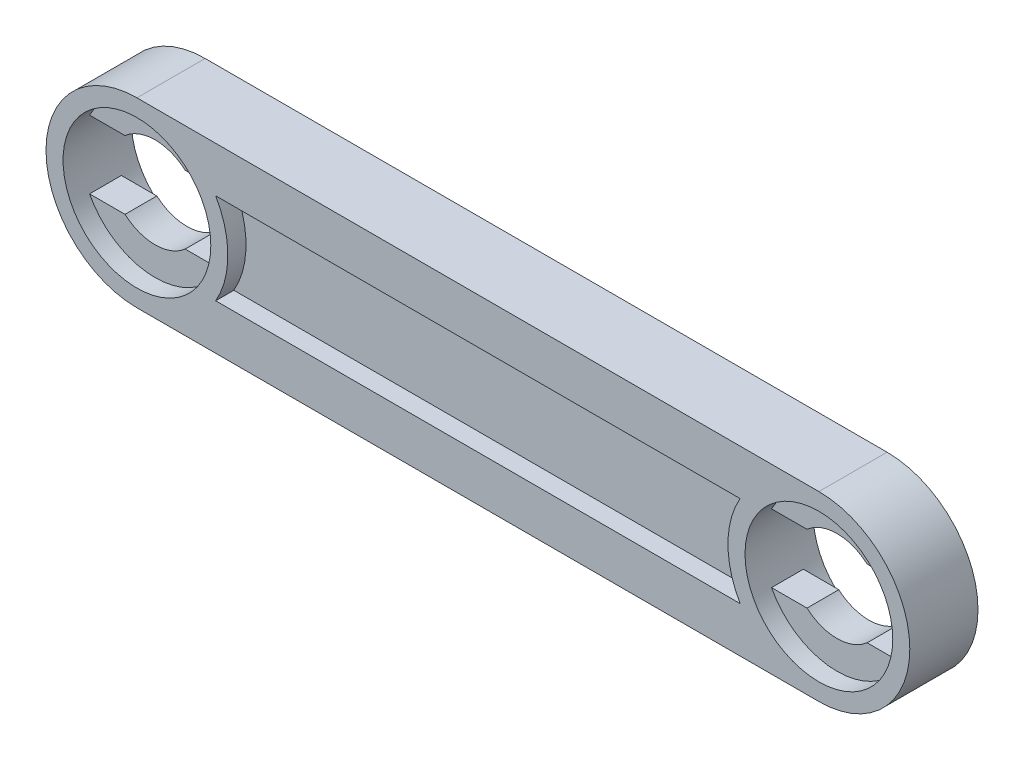
ISO-10303-21;
HEADER;
FILE_DESCRIPTION(('STEP AP214'),'2;1');
FILE_NAME('part.step','',(''),(''),'','','');
FILE_SCHEMA(('AUTOMOTIVE_DESIGN { 1 0 10303 214 1 1 1 1 }'));
ENDSEC;
DATA;
#1=APPLICATION_CONTEXT('core data for automotive mechanical design processes');
#2=APPLICATION_PROTOCOL_DEFINITION('international standard','automotive_design',2000,#1);
#3=PRODUCT_CONTEXT('',#1,'mechanical');
#4=PRODUCT('Part','Part','',(#3));
#5=PRODUCT_RELATED_PRODUCT_CATEGORY('part','',(#4));
#6=PRODUCT_DEFINITION_FORMATION('','',#4);
#7=PRODUCT_DEFINITION_CONTEXT('part definition',#1,'design');
#8=PRODUCT_DEFINITION('design','',#6,#7);
#9=PRODUCT_DEFINITION_SHAPE('','',#8);
#10=(LENGTH_UNIT() NAMED_UNIT(*) SI_UNIT(.MILLI.,.METRE.));
#11=(NAMED_UNIT(*) PLANE_ANGLE_UNIT() SI_UNIT($,.RADIAN.));
#12=(NAMED_UNIT(*) SI_UNIT($,.STERADIAN.) SOLID_ANGLE_UNIT());
#13=UNCERTAINTY_MEASURE_WITH_UNIT(LENGTH_MEASURE(1.E-05),#10,'distance_accuracy_value','');
#14=(GEOMETRIC_REPRESENTATION_CONTEXT(3) GLOBAL_UNCERTAINTY_ASSIGNED_CONTEXT((#13)) GLOBAL_UNIT_ASSIGNED_CONTEXT((#10,
#11,#12)) REPRESENTATION_CONTEXT('',''));
#15=CARTESIAN_POINT('',(0.,0.,0.));
#16=DIRECTION('',(0.,0.,1.));
#17=DIRECTION('',(1.,0.,0.));
#18=AXIS2_PLACEMENT_3D('',#15,#16,#17);
#19=CARTESIAN_POINT('',(0.,0.,0.));
#20=DIRECTION('',(0.,0.,1.));
#21=DIRECTION('',(1.,0.,0.));
#22=AXIS2_PLACEMENT_3D('',#19,#20,#21);
#23=PLANE('',#22);
#24=CARTESIAN_POINT('',(30.,0.,0.));
#25=DIRECTION('',(0.,0.,-1.));
#26=DIRECTION('',(1.,0.,0.));
#27=AXIS2_PLACEMENT_3D('',#24,#25,#26);
#28=CIRCLE('',#27,4.);
#29=CARTESIAN_POINT('',(26.5358983848623,-2.,0.));
#30=VERTEX_POINT('',#29);
#31=CARTESIAN_POINT('',(26.5358983848622,2.,0.));
#32=VERTEX_POINT('',#31);
#33=EDGE_CURVE('E57',#30,#32,#28,.T.);
#34=ORIENTED_EDGE('',*,*,#33,.F.);
#35=DIRECTION('',(1.,0.,0.));
#36=VECTOR('',#35,1.);
#37=CARTESIAN_POINT('',(3.46410161513775,-2.,0.));
#38=LINE('',#37,#36);
#39=CARTESIAN_POINT('',(3.46410161513775,-2.,0.));
#40=VERTEX_POINT('',#39);
#41=EDGE_CURVE('E261',#40,#30,#38,.T.);
#42=ORIENTED_EDGE('',*,*,#41,.F.);
#43=CARTESIAN_POINT('',(0.,0.,0.));
#44=DIRECTION('',(0.,0.,-1.));
#45=DIRECTION('',(1.,0.,0.));
#46=AXIS2_PLACEMENT_3D('',#43,#44,#45);
#47=CIRCLE('',#46,4.);
#48=CARTESIAN_POINT('',(3.46410161513776,2.,0.));
#49=VERTEX_POINT('',#48);
#50=EDGE_CURVE('E275',#49,#40,#47,.T.);
#51=ORIENTED_EDGE('',*,*,#50,.F.);
#52=DIRECTION('',(-1.,0.,0.));
#53=VECTOR('',#52,1.);
#54=CARTESIAN_POINT('',(3.46410161513775,2.,0.));
#55=LINE('',#54,#53);
#56=EDGE_CURVE('E272',#32,#49,#55,.T.);
#57=ORIENTED_EDGE('',*,*,#56,.F.);
#58=EDGE_LOOP('',(#34,#42,#51,#57));
#59=FACE_BOUND('',#58,.T.);
#60=CARTESIAN_POINT('',(0.,0.,0.));
#61=DIRECTION('',(0.,0.,1.));
#62=DIRECTION('',(1.,0.,0.));
#63=AXIS2_PLACEMENT_3D('',#60,#61,#62);
#64=CIRCLE('',#63,4.);
#65=CARTESIAN_POINT('',(0.,4.,0.));
#66=VERTEX_POINT('',#65);
#67=CARTESIAN_POINT('',(0.,-4.,0.));
#68=VERTEX_POINT('',#67);
#69=EDGE_CURVE('E393',#66,#68,#64,.T.);
#70=ORIENTED_EDGE('',*,*,#69,.T.);
#71=DIRECTION('',(1.,0.,0.));
#72=VECTOR('',#71,1.);
#73=CARTESIAN_POINT('',(0.,-4.,0.));
#74=LINE('',#73,#72);
#75=CARTESIAN_POINT('',(30.,-4.,0.));
#76=VERTEX_POINT('',#75);
#77=EDGE_CURVE('E423',#68,#76,#74,.T.);
#78=ORIENTED_EDGE('',*,*,#77,.T.);
#79=CARTESIAN_POINT('',(30.,0.,0.));
#80=DIRECTION('',(0.,0.,1.));
#81=DIRECTION('',(1.,0.,0.));
#82=AXIS2_PLACEMENT_3D('',#79,#80,#81);
#83=CIRCLE('',#82,4.);
#84=CARTESIAN_POINT('',(30.,4.,0.));
#85=VERTEX_POINT('',#84);
#86=EDGE_CURVE('E426',#76,#85,#83,.T.);
#87=ORIENTED_EDGE('',*,*,#86,.T.);
#88=DIRECTION('',(-1.,0.,0.));
#89=VECTOR('',#88,1.);
#90=CARTESIAN_POINT('',(0.,4.,0.));
#91=LINE('',#90,#89);
#92=EDGE_CURVE('E411',#85,#66,#91,.T.);
#93=ORIENTED_EDGE('',*,*,#92,.T.);
#94=EDGE_LOOP('',(#70,#78,#87,#93));
#95=FACE_BOUND('',#94,.T.);
#96=CARTESIAN_POINT('',(0.,0.,0.));
#97=DIRECTION('',(0.,0.,1.));
#98=DIRECTION('',(1.,0.,0.));
#99=AXIS2_PLACEMENT_3D('',#96,#97,#98);
#100=CIRCLE('',#99,3.25);
#101=CARTESIAN_POINT('',(3.25,0.,0.));
#102=VERTEX_POINT('',#101);
#103=EDGE_CURVE('E387',#102,#102,#100,.T.);
#104=ORIENTED_EDGE('',*,*,#103,.F.);
#105=EDGE_LOOP('',(#104));
#106=FACE_BOUND('',#105,.T.);
#107=CARTESIAN_POINT('',(30.,0.,0.));
#108=DIRECTION('',(0.,0.,-1.));
#109=DIRECTION('',(-1.,0.,0.));
#110=AXIS2_PLACEMENT_3D('',#107,#108,#109);
#111=CIRCLE('',#110,3.25);
#112=CARTESIAN_POINT('',(26.75,0.,0.));
#113=VERTEX_POINT('',#112);
#114=EDGE_CURVE('E324',#113,#113,#111,.T.);
#115=ORIENTED_EDGE('',*,*,#114,.T.);
#116=EDGE_LOOP('',(#115));
#117=FACE_BOUND('',#116,.T.);
#118=ADVANCED_FACE('F34',(#59,#95,#106,#117),#23,.T.);
#119=CARTESIAN_POINT('',(32.8831406486677,-1.5,-3.001));
#120=DIRECTION('',(0.,1.,0.));
#121=DIRECTION('',(0.,0.,1.));
#122=AXIS2_PLACEMENT_3D('',#119,#120,#121);
#123=PLANE('',#122);
#124=DIRECTION('',(1.,0.,0.));
#125=VECTOR('',#124,1.);
#126=CARTESIAN_POINT('',(32.8831406486677,-1.5,-2.2));
#127=LINE('',#126,#125);
#128=CARTESIAN_POINT('',(31.3228756555323,-1.5,-2.2));
#129=VERTEX_POINT('',#128);
#130=CARTESIAN_POINT('',(32.8831406486677,-1.5,-2.2));
#131=VERTEX_POINT('',#130);
#132=EDGE_CURVE('E300',#129,#131,#127,.T.);
#133=ORIENTED_EDGE('',*,*,#132,.F.);
#134=DIRECTION('',(0.,0.,1.));
#135=VECTOR('',#134,1.);
#136=CARTESIAN_POINT('',(31.3228756555323,-1.5,-3.001));
#137=LINE('',#136,#135);
#138=CARTESIAN_POINT('',(31.3228756555323,-1.5,-0.8));
#139=VERTEX_POINT('',#138);
#140=EDGE_CURVE('E331',#129,#139,#137,.T.);
#141=ORIENTED_EDGE('',*,*,#140,.T.);
#142=DIRECTION('',(1.,0.,0.));
#143=VECTOR('',#142,1.);
#144=CARTESIAN_POINT('',(32.8831406486677,-1.5,-0.8));
#145=LINE('',#144,#143);
#146=CARTESIAN_POINT('',(32.8831406486677,-1.5,-0.8));
#147=VERTEX_POINT('',#146);
#148=EDGE_CURVE('E318',#139,#147,#145,.T.);
#149=ORIENTED_EDGE('',*,*,#148,.T.);
#150=DIRECTION('',(0.,0.,1.));
#151=VECTOR('',#150,1.);
#152=CARTESIAN_POINT('',(32.8831406486677,-1.5,-3.001));
#153=LINE('',#152,#151);
#154=EDGE_CURVE('E328',#131,#147,#153,.T.);
#155=ORIENTED_EDGE('',*,*,#154,.F.);
#156=EDGE_LOOP('',(#133,#141,#149,#155));
#157=FACE_BOUND('',#156,.T.);
#158=ADVANCED_FACE('F476',(#157),#123,.T.);
#159=CARTESIAN_POINT('',(30.,0.,-3.001));
#160=DIRECTION('',(0.,0.,1.));
#161=DIRECTION('',(1.,0.,0.));
#162=AXIS2_PLACEMENT_3D('',#159,#160,#161);
#163=CYLINDRICAL_SURFACE('',#162,2.);
#164=CARTESIAN_POINT('',(30.,0.,-2.2));
#165=DIRECTION('',(0.,0.,1.));
#166=DIRECTION('',(1.,0.,0.));
#167=AXIS2_PLACEMENT_3D('',#164,#165,#166);
#168=CIRCLE('',#167,2.);
#169=CARTESIAN_POINT('',(28.6771243444677,-1.5,-2.2));
#170=VERTEX_POINT('',#169);
#171=EDGE_CURVE('E298',#170,#129,#168,.T.);
#172=ORIENTED_EDGE('',*,*,#171,.F.);
#173=DIRECTION('',(0.,0.,1.));
#174=VECTOR('',#173,1.);
#175=CARTESIAN_POINT('',(28.6771243444677,-1.5,-3.001));
#176=LINE('',#175,#174);
#177=CARTESIAN_POINT('',(28.6771243444677,-1.5,-0.800000000000001));
#178=VERTEX_POINT('',#177);
#179=EDGE_CURVE('E333',#170,#178,#176,.T.);
#180=ORIENTED_EDGE('',*,*,#179,.T.);
#181=CARTESIAN_POINT('',(30.,0.,-0.8));
#182=DIRECTION('',(0.,0.,1.));
#183=DIRECTION('',(1.,0.,0.));
#184=AXIS2_PLACEMENT_3D('',#181,#182,#183);
#185=CIRCLE('',#184,2.);
#186=EDGE_CURVE('E315',#178,#139,#185,.T.);
#187=ORIENTED_EDGE('',*,*,#186,.T.);
#188=ORIENTED_EDGE('',*,*,#140,.F.);
#189=EDGE_LOOP('',(#172,#180,#187,#188));
#190=FACE_BOUND('',#189,.T.);
#191=ADVANCED_FACE('F482',(#190),#163,.F.);
#192=CARTESIAN_POINT('',(28.6771243444677,-1.5,-3.001));
#193=DIRECTION('',(0.,1.,0.));
#194=DIRECTION('',(0.,0.,1.));
#195=AXIS2_PLACEMENT_3D('',#192,#193,#194);
#196=PLANE('',#195);
#197=DIRECTION('',(1.,0.,0.));
#198=VECTOR('',#197,1.);
#199=CARTESIAN_POINT('',(28.6771243444677,-1.5,-2.2));
#200=LINE('',#199,#198);
#201=CARTESIAN_POINT('',(27.1168593513323,-1.5,-2.2));
#202=VERTEX_POINT('',#201);
#203=EDGE_CURVE('E296',#202,#170,#200,.T.);
#204=ORIENTED_EDGE('',*,*,#203,.F.);
#205=DIRECTION('',(0.,0.,1.));
#206=VECTOR('',#205,1.);
#207=CARTESIAN_POINT('',(27.1168593513323,-1.5,-3.001));
#208=LINE('',#207,#206);
#209=CARTESIAN_POINT('',(27.1168593513323,-1.5,-0.8));
#210=VERTEX_POINT('',#209);
#211=EDGE_CURVE('E335',#202,#210,#208,.T.);
#212=ORIENTED_EDGE('',*,*,#211,.T.);
#213=DIRECTION('',(1.,0.,0.));
#214=VECTOR('',#213,1.);
#215=CARTESIAN_POINT('',(28.6771243444677,-1.5,-0.8));
#216=LINE('',#215,#214);
#217=EDGE_CURVE('E312',#210,#178,#216,.T.);
#218=ORIENTED_EDGE('',*,*,#217,.T.);
#219=ORIENTED_EDGE('',*,*,#179,.F.);
#220=EDGE_LOOP('',(#204,#212,#218,#219));
#221=FACE_BOUND('',#220,.T.);
#222=ADVANCED_FACE('F586',(#221),#196,.T.);
#223=CARTESIAN_POINT('',(28.6771243444677,1.5,-3.001));
#224=DIRECTION('',(0.,-1.,0.));
#225=DIRECTION('',(0.,0.,-1.));
#226=AXIS2_PLACEMENT_3D('',#223,#224,#225);
#227=PLANE('',#226);
#228=DIRECTION('',(-1.,0.,0.));
#229=VECTOR('',#228,1.);
#230=CARTESIAN_POINT('',(28.6771243444677,1.5,-2.2));
#231=LINE('',#230,#229);
#232=CARTESIAN_POINT('',(28.6771243444677,1.5,-2.2));
#233=VERTEX_POINT('',#232);
#234=CARTESIAN_POINT('',(27.1168593513323,1.5,-2.2));
#235=VERTEX_POINT('',#234);
#236=EDGE_CURVE('E294',#233,#235,#231,.T.);
#237=ORIENTED_EDGE('',*,*,#236,.F.);
#238=DIRECTION('',(0.,0.,1.));
#239=VECTOR('',#238,1.);
#240=CARTESIAN_POINT('',(28.6771243444677,1.5,-3.001));
#241=LINE('',#240,#239);
#242=CARTESIAN_POINT('',(28.6771243444677,1.5,-0.8));
#243=VERTEX_POINT('',#242);
#244=EDGE_CURVE('E339',#233,#243,#241,.T.);
#245=ORIENTED_EDGE('',*,*,#244,.T.);
#246=DIRECTION('',(-1.,0.,0.));
#247=VECTOR('',#246,1.);
#248=CARTESIAN_POINT('',(28.6771243444677,1.5,-0.8));
#249=LINE('',#248,#247);
#250=CARTESIAN_POINT('',(27.1168593513323,1.5,-0.8));
#251=VERTEX_POINT('',#250);
#252=EDGE_CURVE('E309',#243,#251,#249,.T.);
#253=ORIENTED_EDGE('',*,*,#252,.T.);
#254=DIRECTION('',(0.,0.,1.));
#255=VECTOR('',#254,1.);
#256=CARTESIAN_POINT('',(27.1168593513323,1.5,-3.001));
#257=LINE('',#256,#255);
#258=EDGE_CURVE('E337',#235,#251,#257,.T.);
#259=ORIENTED_EDGE('',*,*,#258,.F.);
#260=EDGE_LOOP('',(#237,#245,#253,#259));
#261=FACE_BOUND('',#260,.T.);
#262=ADVANCED_FACE('F590',(#261),#227,.T.);
#263=CARTESIAN_POINT('',(30.,0.,-3.001));
#264=DIRECTION('',(0.,0.,1.));
#265=DIRECTION('',(1.,0.,0.));
#266=AXIS2_PLACEMENT_3D('',#263,#264,#265);
#267=CYLINDRICAL_SURFACE('',#266,2.);
#268=CARTESIAN_POINT('',(30.,0.,-2.2));
#269=DIRECTION('',(0.,0.,1.));
#270=DIRECTION('',(1.,0.,0.));
#271=AXIS2_PLACEMENT_3D('',#268,#269,#270);
#272=CIRCLE('',#271,2.);
#273=CARTESIAN_POINT('',(31.3228756555323,1.5,-2.2));
#274=VERTEX_POINT('',#273);
#275=EDGE_CURVE('E292',#274,#233,#272,.T.);
#276=ORIENTED_EDGE('',*,*,#275,.F.);
#277=DIRECTION('',(0.,0.,1.));
#278=VECTOR('',#277,1.);
#279=CARTESIAN_POINT('',(31.3228756555323,1.5,-3.001));
#280=LINE('',#279,#278);
#281=CARTESIAN_POINT('',(31.3228756555323,1.5,-0.800000000000001));
#282=VERTEX_POINT('',#281);
#283=EDGE_CURVE('E341',#274,#282,#280,.T.);
#284=ORIENTED_EDGE('',*,*,#283,.T.);
#285=CARTESIAN_POINT('',(30.,0.,-0.8));
#286=DIRECTION('',(0.,0.,1.));
#287=DIRECTION('',(1.,0.,0.));
#288=AXIS2_PLACEMENT_3D('',#285,#286,#287);
#289=CIRCLE('',#288,2.);
#290=EDGE_CURVE('E306',#282,#243,#289,.T.);
#291=ORIENTED_EDGE('',*,*,#290,.T.);
#292=ORIENTED_EDGE('',*,*,#244,.F.);
#293=EDGE_LOOP('',(#276,#284,#291,#292));
#294=FACE_BOUND('',#293,.T.);
#295=ADVANCED_FACE('F532',(#294),#267,.F.);
#296=CARTESIAN_POINT('',(32.8831406486677,1.5,-3.001));
#297=DIRECTION('',(0.,-1.,0.));
#298=DIRECTION('',(0.,0.,-1.));
#299=AXIS2_PLACEMENT_3D('',#296,#297,#298);
#300=PLANE('',#299);
#301=DIRECTION('',(-1.,0.,0.));
#302=VECTOR('',#301,1.);
#303=CARTESIAN_POINT('',(32.8831406486677,1.5,-2.2));
#304=LINE('',#303,#302);
#305=CARTESIAN_POINT('',(32.8831406486677,1.5,-2.2));
#306=VERTEX_POINT('',#305);
#307=EDGE_CURVE('E290',#306,#274,#304,.T.);
#308=ORIENTED_EDGE('',*,*,#307,.F.);
#309=DIRECTION('',(0.,0.,1.));
#310=VECTOR('',#309,1.);
#311=CARTESIAN_POINT('',(32.8831406486677,1.5,-3.001));
#312=LINE('',#311,#310);
#313=CARTESIAN_POINT('',(32.8831406486677,1.5,-0.8));
#314=VERTEX_POINT('',#313);
#315=EDGE_CURVE('E327',#306,#314,#312,.T.);
#316=ORIENTED_EDGE('',*,*,#315,.T.);
#317=DIRECTION('',(-1.,0.,0.));
#318=VECTOR('',#317,1.);
#319=CARTESIAN_POINT('',(32.8831406486677,1.5,-0.8));
#320=LINE('',#319,#318);
#321=EDGE_CURVE('E11',#314,#282,#320,.T.);
#322=ORIENTED_EDGE('',*,*,#321,.T.);
#323=ORIENTED_EDGE('',*,*,#283,.F.);
#324=EDGE_LOOP('',(#308,#316,#322,#323));
#325=FACE_BOUND('',#324,.T.);
#326=ADVANCED_FACE('F518',(#325),#300,.T.);
#327=CARTESIAN_POINT('',(0.,0.,-3.));
#328=DIRECTION('',(0.,0.,1.));
#329=DIRECTION('',(1.,0.,0.));
#330=AXIS2_PLACEMENT_3D('',#327,#328,#329);
#331=PLANE('',#330);
#332=DIRECTION('',(-1.,0.,0.));
#333=VECTOR('',#332,1.);
#334=CARTESIAN_POINT('',(26.,-2.,-3.));
#335=LINE('',#334,#333);
#336=CARTESIAN_POINT('',(26.,-2.,-3.));
#337=VERTEX_POINT('',#336);
#338=CARTESIAN_POINT('',(4.,-2.,-3.));
#339=VERTEX_POINT('',#338);
#340=EDGE_CURVE('E248',#337,#339,#335,.T.);
#341=ORIENTED_EDGE('',*,*,#340,.F.);
#342=DIRECTION('',(0.,-1.,0.));
#343=VECTOR('',#342,1.);
#344=CARTESIAN_POINT('',(26.,-2.,-3.));
#345=LINE('',#344,#343);
#346=CARTESIAN_POINT('',(26.,2.,-3.));
#347=VERTEX_POINT('',#346);
#348=EDGE_CURVE('E49',#347,#337,#345,.T.);
#349=ORIENTED_EDGE('',*,*,#348,.F.);
#350=DIRECTION('',(1.,0.,0.));
#351=VECTOR('',#350,1.);
#352=CARTESIAN_POINT('',(26.,2.,-3.));
#353=LINE('',#352,#351);
#354=CARTESIAN_POINT('',(4.,2.,-3.));
#355=VERTEX_POINT('',#354);
#356=EDGE_CURVE('E239',#355,#347,#353,.T.);
#357=ORIENTED_EDGE('',*,*,#356,.F.);
#358=DIRECTION('',(0.,1.,0.));
#359=VECTOR('',#358,1.);
#360=CARTESIAN_POINT('',(4.,-2.,-3.));
#361=LINE('',#360,#359);
#362=EDGE_CURVE('E242',#339,#355,#361,.T.);
#363=ORIENTED_EDGE('',*,*,#362,.F.);
#364=EDGE_LOOP('',(#341,#349,#357,#363));
#365=FACE_BOUND('',#364,.T.);
#366=CARTESIAN_POINT('',(0.,0.,-3.));
#367=DIRECTION('',(0.,0.,1.));
#368=DIRECTION('',(1.,0.,0.));
#369=AXIS2_PLACEMENT_3D('',#366,#367,#368);
#370=CIRCLE('',#369,3.25);
#371=CARTESIAN_POINT('',(3.25,0.,-3.));
#372=VERTEX_POINT('',#371);
#373=EDGE_CURVE('E384',#372,#372,#370,.F.);
#374=ORIENTED_EDGE('',*,*,#373,.F.);
#375=EDGE_LOOP('',(#374));
#376=FACE_BOUND('',#375,.T.);
#377=CARTESIAN_POINT('',(0.,0.,-3.));
#378=DIRECTION('',(0.,0.,1.));
#379=DIRECTION('',(1.,0.,0.));
#380=AXIS2_PLACEMENT_3D('',#377,#378,#379);
#381=CIRCLE('',#380,4.);
#382=CARTESIAN_POINT('',(0.,4.,-3.));
#383=VERTEX_POINT('',#382);
#384=CARTESIAN_POINT('',(0.,-4.,-3.));
#385=VERTEX_POINT('',#384);
#386=EDGE_CURVE('E407',#383,#385,#381,.T.);
#387=ORIENTED_EDGE('',*,*,#386,.F.);
#388=DIRECTION('',(-1.,0.,0.));
#389=VECTOR('',#388,1.);
#390=CARTESIAN_POINT('',(0.,4.,-3.));
#391=LINE('',#390,#389);
#392=CARTESIAN_POINT('',(30.,4.,-3.));
#393=VERTEX_POINT('',#392);
#394=EDGE_CURVE('E417',#393,#383,#391,.T.);
#395=ORIENTED_EDGE('',*,*,#394,.F.);
#396=CARTESIAN_POINT('',(30.,0.,-3.));
#397=DIRECTION('',(0.,0.,1.));
#398=DIRECTION('',(1.,0.,0.));
#399=AXIS2_PLACEMENT_3D('',#396,#397,#398);
#400=CIRCLE('',#399,4.);
#401=CARTESIAN_POINT('',(30.,-4.,-3.));
#402=VERTEX_POINT('',#401);
#403=EDGE_CURVE('E414',#402,#393,#400,.T.);
#404=ORIENTED_EDGE('',*,*,#403,.F.);
#405=DIRECTION('',(1.,0.,0.));
#406=VECTOR('',#405,1.);
#407=CARTESIAN_POINT('',(0.,-4.,-3.));
#408=LINE('',#407,#406);
#409=EDGE_CURVE('E410',#385,#402,#408,.T.);
#410=ORIENTED_EDGE('',*,*,#409,.F.);
#411=EDGE_LOOP('',(#387,#395,#404,#410));
#412=FACE_BOUND('',#411,.T.);
#413=CARTESIAN_POINT('',(30.,0.,-3.));
#414=DIRECTION('',(0.,0.,1.));
#415=DIRECTION('',(1.,0.,0.));
#416=AXIS2_PLACEMENT_3D('',#413,#414,#415);
#417=CIRCLE('',#416,3.25);
#418=CARTESIAN_POINT('',(33.25,0.,-3.));
#419=VERTEX_POINT('',#418);
#420=EDGE_CURVE('E321',#419,#419,#417,.T.);
#421=ORIENTED_EDGE('',*,*,#420,.T.);
#422=EDGE_LOOP('',(#421));
#423=FACE_BOUND('',#422,.T.);
#424=ADVANCED_FACE('F488',(#365,#376,#412,#423),#331,.F.);
#425=CARTESIAN_POINT('',(-2.8831406486677,1.5,-3.001));
#426=DIRECTION('',(0.,1.,0.));
#427=DIRECTION('',(0.,0.,1.));
#428=AXIS2_PLACEMENT_3D('',#425,#426,#427);
#429=PLANE('',#428);
#430=DIRECTION('',(0.,0.,1.));
#431=VECTOR('',#430,1.);
#432=CARTESIAN_POINT('',(-2.8831406486677,1.5,-3.001));
#433=LINE('',#432,#431);
#434=CARTESIAN_POINT('',(-2.8831406486677,1.5,-2.2));
#435=VERTEX_POINT('',#434);
#436=CARTESIAN_POINT('',(-2.8831406486677,1.5,-0.8));
#437=VERTEX_POINT('',#436);
#438=EDGE_CURVE('E391',#435,#437,#433,.T.);
#439=ORIENTED_EDGE('',*,*,#438,.F.);
#440=DIRECTION('',(1.,0.,0.));
#441=VECTOR('',#440,1.);
#442=CARTESIAN_POINT('',(-2.8831406486677,1.5,-2.2));
#443=LINE('',#442,#441);
#444=CARTESIAN_POINT('',(-1.3228756555323,1.5,-2.2));
#445=VERTEX_POINT('',#444);
#446=EDGE_CURVE('E362',#435,#445,#443,.T.);
#447=ORIENTED_EDGE('',*,*,#446,.T.);
#448=DIRECTION('',(0.,0.,1.));
#449=VECTOR('',#448,1.);
#450=CARTESIAN_POINT('',(-1.3228756555323,1.5,-3.001));
#451=LINE('',#450,#449);
#452=CARTESIAN_POINT('',(-1.3228756555323,1.5,-0.8));
#453=VERTEX_POINT('',#452);
#454=EDGE_CURVE('E394',#445,#453,#451,.T.);
#455=ORIENTED_EDGE('',*,*,#454,.T.);
#456=DIRECTION('',(1.,0.,0.));
#457=VECTOR('',#456,1.);
#458=CARTESIAN_POINT('',(-2.8831406486677,1.5,-0.8));
#459=LINE('',#458,#457);
#460=EDGE_CURVE('E381',#437,#453,#459,.T.);
#461=ORIENTED_EDGE('',*,*,#460,.F.);
#462=EDGE_LOOP('',(#439,#447,#455,#461));
#463=FACE_BOUND('',#462,.T.);
#464=ADVANCED_FACE('F517',(#463),#429,.F.);
#465=CARTESIAN_POINT('',(0.,0.,-3.001));
#466=DIRECTION('',(0.,0.,1.));
#467=DIRECTION('',(1.,0.,0.));
#468=AXIS2_PLACEMENT_3D('',#465,#466,#467);
#469=CYLINDRICAL_SURFACE('',#468,2.);
#470=ORIENTED_EDGE('',*,*,#454,.F.);
#471=CARTESIAN_POINT('',(0.,0.,-2.2));
#472=DIRECTION('',(0.,0.,1.));
#473=DIRECTION('',(1.,0.,0.));
#474=AXIS2_PLACEMENT_3D('',#471,#472,#473);
#475=CIRCLE('',#474,2.);
#476=CARTESIAN_POINT('',(1.3228756555323,1.5,-2.2));
#477=VERTEX_POINT('',#476);
#478=EDGE_CURVE('E359',#445,#477,#475,.F.);
#479=ORIENTED_EDGE('',*,*,#478,.T.);
#480=DIRECTION('',(0.,0.,1.));
#481=VECTOR('',#480,1.);
#482=CARTESIAN_POINT('',(1.3228756555323,1.5,-3.001));
#483=LINE('',#482,#481);
#484=CARTESIAN_POINT('',(1.3228756555323,1.5,-0.800000000000001));
#485=VERTEX_POINT('',#484);
#486=EDGE_CURVE('E396',#477,#485,#483,.T.);
#487=ORIENTED_EDGE('',*,*,#486,.T.);
#488=CARTESIAN_POINT('',(0.,0.,-0.8));
#489=DIRECTION('',(0.,0.,1.));
#490=DIRECTION('',(1.,0.,0.));
#491=AXIS2_PLACEMENT_3D('',#488,#489,#490);
#492=CIRCLE('',#491,2.);
#493=EDGE_CURVE('E378',#453,#485,#492,.F.);
#494=ORIENTED_EDGE('',*,*,#493,.F.);
#495=EDGE_LOOP('',(#470,#479,#487,#494));
#496=FACE_BOUND('',#495,.T.);
#497=ADVANCED_FACE('F529',(#496),#469,.F.);
#498=CARTESIAN_POINT('',(1.3228756555323,1.5,-3.001));
#499=DIRECTION('',(0.,1.,0.));
#500=DIRECTION('',(0.,0.,1.));
#501=AXIS2_PLACEMENT_3D('',#498,#499,#500);
#502=PLANE('',#501);
#503=ORIENTED_EDGE('',*,*,#486,.F.);
#504=DIRECTION('',(1.,0.,0.));
#505=VECTOR('',#504,1.);
#506=CARTESIAN_POINT('',(1.3228756555323,1.5,-2.2));
#507=LINE('',#506,#505);
#508=CARTESIAN_POINT('',(2.8831406486677,1.5,-2.2));
#509=VERTEX_POINT('',#508);
#510=EDGE_CURVE('E356',#477,#509,#507,.T.);
#511=ORIENTED_EDGE('',*,*,#510,.T.);
#512=DIRECTION('',(0.,0.,1.));
#513=VECTOR('',#512,1.);
#514=CARTESIAN_POINT('',(2.8831406486677,1.5,-3.001));
#515=LINE('',#514,#513);
#516=CARTESIAN_POINT('',(2.8831406486677,1.5,-0.8));
#517=VERTEX_POINT('',#516);
#518=EDGE_CURVE('E398',#509,#517,#515,.T.);
#519=ORIENTED_EDGE('',*,*,#518,.T.);
#520=DIRECTION('',(1.,0.,0.));
#521=VECTOR('',#520,1.);
#522=CARTESIAN_POINT('',(1.3228756555323,1.5,-0.8));
#523=LINE('',#522,#521);
#524=EDGE_CURVE('E375',#485,#517,#523,.T.);
#525=ORIENTED_EDGE('',*,*,#524,.F.);
#526=EDGE_LOOP('',(#503,#511,#519,#525));
#527=FACE_BOUND('',#526,.T.);
#528=ADVANCED_FACE('F807',(#527),#502,.F.);
#529=CARTESIAN_POINT('',(1.3228756555323,-1.5,-3.001));
#530=DIRECTION('',(0.,-1.,0.));
#531=DIRECTION('',(0.,0.,-1.));
#532=AXIS2_PLACEMENT_3D('',#529,#530,#531);
#533=PLANE('',#532);
#534=DIRECTION('',(0.,0.,1.));
#535=VECTOR('',#534,1.);
#536=CARTESIAN_POINT('',(2.8831406486677,-1.5,-3.001));
#537=LINE('',#536,#535);
#538=CARTESIAN_POINT('',(2.8831406486677,-1.5,-2.2));
#539=VERTEX_POINT('',#538);
#540=CARTESIAN_POINT('',(2.8831406486677,-1.5,-0.8));
#541=VERTEX_POINT('',#540);
#542=EDGE_CURVE('E400',#539,#541,#537,.T.);
#543=ORIENTED_EDGE('',*,*,#542,.F.);
#544=DIRECTION('',(-1.,0.,0.));
#545=VECTOR('',#544,1.);
#546=CARTESIAN_POINT('',(1.3228756555323,-1.5,-2.2));
#547=LINE('',#546,#545);
#548=CARTESIAN_POINT('',(1.32287565553229,-1.5,-2.2));
#549=VERTEX_POINT('',#548);
#550=EDGE_CURVE('E353',#539,#549,#547,.T.);
#551=ORIENTED_EDGE('',*,*,#550,.T.);
#552=DIRECTION('',(0.,0.,1.));
#553=VECTOR('',#552,1.);
#554=CARTESIAN_POINT('',(1.32287565553229,-1.5,-3.001));
#555=LINE('',#554,#553);
#556=CARTESIAN_POINT('',(1.32287565553229,-1.5,-0.8));
#557=VERTEX_POINT('',#556);
#558=EDGE_CURVE('E402',#549,#557,#555,.T.);
#559=ORIENTED_EDGE('',*,*,#558,.T.);
#560=DIRECTION('',(-1.,0.,0.));
#561=VECTOR('',#560,1.);
#562=CARTESIAN_POINT('',(1.3228756555323,-1.5,-0.8));
#563=LINE('',#562,#561);
#564=EDGE_CURVE('E372',#541,#557,#563,.T.);
#565=ORIENTED_EDGE('',*,*,#564,.F.);
#566=EDGE_LOOP('',(#543,#551,#559,#565));
#567=FACE_BOUND('',#566,.T.);
#568=ADVANCED_FACE('F454',(#567),#533,.F.);
#569=CARTESIAN_POINT('',(0.,0.,-3.001));
#570=DIRECTION('',(0.,0.,1.));
#571=DIRECTION('',(1.,0.,0.));
#572=AXIS2_PLACEMENT_3D('',#569,#570,#571);
#573=CYLINDRICAL_SURFACE('',#572,2.);
#574=ORIENTED_EDGE('',*,*,#558,.F.);
#575=CARTESIAN_POINT('',(0.,0.,-2.2));
#576=DIRECTION('',(0.,0.,1.));
#577=DIRECTION('',(1.,0.,0.));
#578=AXIS2_PLACEMENT_3D('',#575,#576,#577);
#579=CIRCLE('',#578,2.);
#580=CARTESIAN_POINT('',(-1.3228756555323,-1.5,-2.2));
#581=VERTEX_POINT('',#580);
#582=EDGE_CURVE('E350',#549,#581,#579,.F.);
#583=ORIENTED_EDGE('',*,*,#582,.T.);
#584=DIRECTION('',(0.,0.,1.));
#585=VECTOR('',#584,1.);
#586=CARTESIAN_POINT('',(-1.3228756555323,-1.5,-3.001));
#587=LINE('',#586,#585);
#588=CARTESIAN_POINT('',(-1.3228756555323,-1.5,-0.800000000000001));
#589=VERTEX_POINT('',#588);
#590=EDGE_CURVE('E404',#581,#589,#587,.T.);
#591=ORIENTED_EDGE('',*,*,#590,.T.);
#592=CARTESIAN_POINT('',(0.,0.,-0.8));
#593=DIRECTION('',(0.,0.,1.));
#594=DIRECTION('',(1.,0.,0.));
#595=AXIS2_PLACEMENT_3D('',#592,#593,#594);
#596=CIRCLE('',#595,2.);
#597=EDGE_CURVE('E369',#557,#589,#596,.F.);
#598=ORIENTED_EDGE('',*,*,#597,.F.);
#599=EDGE_LOOP('',(#574,#583,#591,#598));
#600=FACE_BOUND('',#599,.T.);
#601=ADVANCED_FACE('F457',(#600),#573,.F.);
#602=CARTESIAN_POINT('',(-2.8831406486677,-1.5,-3.001));
#603=DIRECTION('',(0.,-1.,0.));
#604=DIRECTION('',(0.,0.,-1.));
#605=AXIS2_PLACEMENT_3D('',#602,#603,#604);
#606=PLANE('',#605);
#607=ORIENTED_EDGE('',*,*,#590,.F.);
#608=DIRECTION('',(-1.,0.,0.));
#609=VECTOR('',#608,1.);
#610=CARTESIAN_POINT('',(-2.8831406486677,-1.5,-2.2));
#611=LINE('',#610,#609);
#612=CARTESIAN_POINT('',(-2.8831406486677,-1.5,-2.2));
#613=VERTEX_POINT('',#612);
#614=EDGE_CURVE('E347',#581,#613,#611,.T.);
#615=ORIENTED_EDGE('',*,*,#614,.T.);
#616=DIRECTION('',(0.,0.,1.));
#617=VECTOR('',#616,1.);
#618=CARTESIAN_POINT('',(-2.8831406486677,-1.5,-3.001));
#619=LINE('',#618,#617);
#620=CARTESIAN_POINT('',(-2.8831406486677,-1.5,-0.8));
#621=VERTEX_POINT('',#620);
#622=EDGE_CURVE('E390',#613,#621,#619,.T.);
#623=ORIENTED_EDGE('',*,*,#622,.T.);
#624=DIRECTION('',(-1.,0.,0.));
#625=VECTOR('',#624,1.);
#626=CARTESIAN_POINT('',(-2.8831406486677,-1.5,-0.8));
#627=LINE('',#626,#625);
#628=EDGE_CURVE('E42',#589,#621,#627,.T.);
#629=ORIENTED_EDGE('',*,*,#628,.F.);
#630=EDGE_LOOP('',(#607,#615,#623,#629));
#631=FACE_BOUND('',#630,.T.);
#632=ADVANCED_FACE('F458',(#631),#606,.F.);
#633=CARTESIAN_POINT('',(0.,0.,-3.));
#634=DIRECTION('',(0.,0.,1.));
#635=DIRECTION('',(1.,0.,0.));
#636=AXIS2_PLACEMENT_3D('',#633,#634,#635);
#637=CYLINDRICAL_SURFACE('',#636,4.);
#638=ORIENTED_EDGE('',*,*,#69,.F.);
#639=DIRECTION('',(0.,0.,1.));
#640=VECTOR('',#639,1.);
#641=CARTESIAN_POINT('',(0.,4.,-3.));
#642=LINE('',#641,#640);
#643=EDGE_CURVE('E431',#383,#66,#642,.T.);
#644=ORIENTED_EDGE('',*,*,#643,.F.);
#645=ORIENTED_EDGE('',*,*,#386,.T.);
#646=DIRECTION('',(0.,0.,1.));
#647=VECTOR('',#646,1.);
#648=CARTESIAN_POINT('',(0.,-4.,-3.));
#649=LINE('',#648,#647);
#650=EDGE_CURVE('E420',#385,#68,#649,.T.);
#651=ORIENTED_EDGE('',*,*,#650,.T.);
#652=EDGE_LOOP('',(#638,#644,#645,#651));
#653=FACE_BOUND('',#652,.T.);
#654=ADVANCED_FACE('F36',(#653),#637,.T.);
#655=CARTESIAN_POINT('',(0.,4.,-3.));
#656=DIRECTION('',(0.,1.,0.));
#657=DIRECTION('',(0.,0.,1.));
#658=AXIS2_PLACEMENT_3D('',#655,#656,#657);
#659=PLANE('',#658);
#660=ORIENTED_EDGE('',*,*,#92,.F.);
#661=DIRECTION('',(0.,0.,1.));
#662=VECTOR('',#661,1.);
#663=CARTESIAN_POINT('',(30.,4.,-3.));
#664=LINE('',#663,#662);
#665=EDGE_CURVE('E433',#393,#85,#664,.T.);
#666=ORIENTED_EDGE('',*,*,#665,.F.);
#667=ORIENTED_EDGE('',*,*,#394,.T.);
#668=ORIENTED_EDGE('',*,*,#643,.T.);
#669=EDGE_LOOP('',(#660,#666,#667,#668));
#670=FACE_BOUND('',#669,.T.);
#671=ADVANCED_FACE('F490',(#670),#659,.T.);
#672=CARTESIAN_POINT('',(30.,0.,-3.));
#673=DIRECTION('',(0.,0.,1.));
#674=DIRECTION('',(1.,0.,0.));
#675=AXIS2_PLACEMENT_3D('',#672,#673,#674);
#676=CYLINDRICAL_SURFACE('',#675,4.);
#677=ORIENTED_EDGE('',*,*,#86,.F.);
#678=DIRECTION('',(0.,0.,1.));
#679=VECTOR('',#678,1.);
#680=CARTESIAN_POINT('',(30.,-4.,-3.));
#681=LINE('',#680,#679);
#682=EDGE_CURVE('E435',#402,#76,#681,.T.);
#683=ORIENTED_EDGE('',*,*,#682,.F.);
#684=ORIENTED_EDGE('',*,*,#403,.T.);
#685=ORIENTED_EDGE('',*,*,#665,.T.);
#686=EDGE_LOOP('',(#677,#683,#684,#685));
#687=FACE_BOUND('',#686,.T.);
#688=ADVANCED_FACE('F493',(#687),#676,.T.);
#689=CARTESIAN_POINT('',(0.,-4.,-3.));
#690=DIRECTION('',(0.,-1.,0.));
#691=DIRECTION('',(0.,0.,-1.));
#692=AXIS2_PLACEMENT_3D('',#689,#690,#691);
#693=PLANE('',#692);
#694=ORIENTED_EDGE('',*,*,#77,.F.);
#695=ORIENTED_EDGE('',*,*,#650,.F.);
#696=ORIENTED_EDGE('',*,*,#409,.T.);
#697=ORIENTED_EDGE('',*,*,#682,.T.);
#698=EDGE_LOOP('',(#694,#695,#696,#697));
#699=FACE_BOUND('',#698,.T.);
#700=ADVANCED_FACE('F496',(#699),#693,.T.);
#701=CARTESIAN_POINT('',(0.,0.,-3.001));
#702=DIRECTION('',(0.,0.,1.));
#703=DIRECTION('',(1.,0.,0.));
#704=AXIS2_PLACEMENT_3D('',#701,#702,#703);
#705=CYLINDRICAL_SURFACE('',#704,3.25);
#706=CARTESIAN_POINT('',(0.,0.,-2.2));
#707=DIRECTION('',(0.,0.,1.));
#708=DIRECTION('',(1.,0.,0.));
#709=AXIS2_PLACEMENT_3D('',#706,#707,#708);
#710=CIRCLE('',#709,3.25);
#711=EDGE_CURVE('E344',#509,#435,#710,.T.);
#712=ORIENTED_EDGE('',*,*,#711,.T.);
#713=ORIENTED_EDGE('',*,*,#438,.T.);
#714=CARTESIAN_POINT('',(0.,0.,-0.8));
#715=DIRECTION('',(0.,0.,1.));
#716=DIRECTION('',(1.,0.,0.));
#717=AXIS2_PLACEMENT_3D('',#714,#715,#716);
#718=CIRCLE('',#717,3.25);
#719=EDGE_CURVE('E366',#517,#437,#718,.T.);
#720=ORIENTED_EDGE('',*,*,#719,.F.);
#721=ORIENTED_EDGE('',*,*,#518,.F.);
#722=EDGE_LOOP('',(#712,#713,#720,#721));
#723=FACE_BOUND('',#722,.T.);
#724=EDGE_CURVE('E330',#613,#539,#710,.T.);
#725=ORIENTED_EDGE('',*,*,#724,.T.);
#726=ORIENTED_EDGE('',*,*,#542,.T.);
#727=EDGE_CURVE('E365',#621,#541,#718,.T.);
#728=ORIENTED_EDGE('',*,*,#727,.F.);
#729=ORIENTED_EDGE('',*,*,#622,.F.);
#730=EDGE_LOOP('',(#725,#726,#728,#729));
#731=FACE_BOUND('',#730,.T.);
#732=ORIENTED_EDGE('',*,*,#103,.T.);
#733=EDGE_LOOP('',(#732));
#734=FACE_BOUND('',#733,.T.);
#735=ORIENTED_EDGE('',*,*,#373,.T.);
#736=EDGE_LOOP('',(#735));
#737=FACE_BOUND('',#736,.T.);
#738=ADVANCED_FACE('F450',(#723,#731,#734,#737),#705,.F.);
#739=CARTESIAN_POINT('',(0.,0.,-0.8));
#740=DIRECTION('',(0.,0.,1.));
#741=DIRECTION('',(1.,0.,0.));
#742=AXIS2_PLACEMENT_3D('',#739,#740,#741);
#743=PLANE('',#742);
#744=ORIENTED_EDGE('',*,*,#564,.T.);
#745=ORIENTED_EDGE('',*,*,#597,.T.);
#746=ORIENTED_EDGE('',*,*,#628,.T.);
#747=ORIENTED_EDGE('',*,*,#727,.T.);
#748=EDGE_LOOP('',(#744,#745,#746,#747));
#749=FACE_BOUND('',#748,.T.);
#750=ADVANCED_FACE('F442',(#749),#743,.T.);
#751=ORIENTED_EDGE('',*,*,#460,.T.);
#752=ORIENTED_EDGE('',*,*,#493,.T.);
#753=ORIENTED_EDGE('',*,*,#524,.T.);
#754=ORIENTED_EDGE('',*,*,#719,.T.);
#755=EDGE_LOOP('',(#751,#752,#753,#754));
#756=FACE_BOUND('',#755,.T.);
#757=ADVANCED_FACE('F472',(#756),#743,.T.);
#758=CARTESIAN_POINT('',(0.,0.,-2.2));
#759=DIRECTION('',(0.,0.,1.));
#760=DIRECTION('',(1.,0.,0.));
#761=AXIS2_PLACEMENT_3D('',#758,#759,#760);
#762=PLANE('',#761);
#763=ORIENTED_EDGE('',*,*,#711,.F.);
#764=ORIENTED_EDGE('',*,*,#510,.F.);
#765=ORIENTED_EDGE('',*,*,#478,.F.);
#766=ORIENTED_EDGE('',*,*,#446,.F.);
#767=EDGE_LOOP('',(#763,#764,#765,#766));
#768=FACE_BOUND('',#767,.T.);
#769=ADVANCED_FACE('F463',(#768),#762,.F.);
#770=ORIENTED_EDGE('',*,*,#724,.F.);
#771=ORIENTED_EDGE('',*,*,#614,.F.);
#772=ORIENTED_EDGE('',*,*,#582,.F.);
#773=ORIENTED_EDGE('',*,*,#550,.F.);
#774=EDGE_LOOP('',(#770,#771,#772,#773));
#775=FACE_BOUND('',#774,.T.);
#776=ADVANCED_FACE('F460',(#775),#762,.F.);
#777=CARTESIAN_POINT('',(30.,0.,-3.001));
#778=DIRECTION('',(0.,0.,1.));
#779=DIRECTION('',(1.,0.,0.));
#780=AXIS2_PLACEMENT_3D('',#777,#778,#779);
#781=CYLINDRICAL_SURFACE('',#780,3.25);
#782=CARTESIAN_POINT('',(30.,0.,-2.2));
#783=DIRECTION('',(0.,0.,-1.));
#784=DIRECTION('',(-1.,0.,0.));
#785=AXIS2_PLACEMENT_3D('',#782,#783,#784);
#786=CIRCLE('',#785,3.25);
#787=EDGE_CURVE('E282',#131,#202,#786,.T.);
#788=ORIENTED_EDGE('',*,*,#787,.F.);
#789=ORIENTED_EDGE('',*,*,#154,.T.);
#790=CARTESIAN_POINT('',(30.,0.,-0.8));
#791=DIRECTION('',(0.,0.,-1.));
#792=DIRECTION('',(-1.,0.,0.));
#793=AXIS2_PLACEMENT_3D('',#790,#791,#792);
#794=CIRCLE('',#793,3.25);
#795=EDGE_CURVE('E302',#147,#210,#794,.T.);
#796=ORIENTED_EDGE('',*,*,#795,.T.);
#797=ORIENTED_EDGE('',*,*,#211,.F.);
#798=EDGE_LOOP('',(#788,#789,#796,#797));
#799=FACE_BOUND('',#798,.T.);
#800=EDGE_CURVE('E288',#235,#306,#786,.T.);
#801=ORIENTED_EDGE('',*,*,#800,.F.);
#802=ORIENTED_EDGE('',*,*,#258,.T.);
#803=EDGE_CURVE('E303',#251,#314,#794,.T.);
#804=ORIENTED_EDGE('',*,*,#803,.T.);
#805=ORIENTED_EDGE('',*,*,#315,.F.);
#806=EDGE_LOOP('',(#801,#802,#804,#805));
#807=FACE_BOUND('',#806,.T.);
#808=ORIENTED_EDGE('',*,*,#420,.F.);
#809=EDGE_LOOP('',(#808));
#810=FACE_BOUND('',#809,.T.);
#811=ORIENTED_EDGE('',*,*,#114,.F.);
#812=EDGE_LOOP('',(#811));
#813=FACE_BOUND('',#812,.T.);
#814=ADVANCED_FACE('F462',(#799,#807,#810,#813),#781,.F.);
#815=CARTESIAN_POINT('',(30.,0.,-0.8));
#816=DIRECTION('',(0.,0.,1.));
#817=DIRECTION('',(-1.,0.,0.));
#818=AXIS2_PLACEMENT_3D('',#815,#816,#817);
#819=PLANE('',#818);
#820=ORIENTED_EDGE('',*,*,#290,.F.);
#821=ORIENTED_EDGE('',*,*,#321,.F.);
#822=ORIENTED_EDGE('',*,*,#803,.F.);
#823=ORIENTED_EDGE('',*,*,#252,.F.);
#824=EDGE_LOOP('',(#820,#821,#822,#823));
#825=FACE_BOUND('',#824,.T.);
#826=ADVANCED_FACE('F469',(#825),#819,.T.);
#827=ORIENTED_EDGE('',*,*,#186,.F.);
#828=ORIENTED_EDGE('',*,*,#217,.F.);
#829=ORIENTED_EDGE('',*,*,#795,.F.);
#830=ORIENTED_EDGE('',*,*,#148,.F.);
#831=EDGE_LOOP('',(#827,#828,#829,#830));
#832=FACE_BOUND('',#831,.T.);
#833=ADVANCED_FACE('F581',(#832),#819,.T.);
#834=CARTESIAN_POINT('',(30.,0.,-2.2));
#835=DIRECTION('',(0.,0.,1.));
#836=DIRECTION('',(-1.,0.,0.));
#837=AXIS2_PLACEMENT_3D('',#834,#835,#836);
#838=PLANE('',#837);
#839=ORIENTED_EDGE('',*,*,#132,.T.);
#840=ORIENTED_EDGE('',*,*,#787,.T.);
#841=ORIENTED_EDGE('',*,*,#203,.T.);
#842=ORIENTED_EDGE('',*,*,#171,.T.);
#843=EDGE_LOOP('',(#839,#840,#841,#842));
#844=FACE_BOUND('',#843,.T.);
#845=ADVANCED_FACE('F578',(#844),#838,.F.);
#846=ORIENTED_EDGE('',*,*,#236,.T.);
#847=ORIENTED_EDGE('',*,*,#800,.T.);
#848=ORIENTED_EDGE('',*,*,#307,.T.);
#849=ORIENTED_EDGE('',*,*,#275,.T.);
#850=EDGE_LOOP('',(#846,#847,#848,#849));
#851=FACE_BOUND('',#850,.T.);
#852=ADVANCED_FACE('F575',(#851),#838,.F.);
#853=CARTESIAN_POINT('',(30.,0.,-0.8));
#854=DIRECTION('',(0.,0.,1.));
#855=DIRECTION('',(1.,0.,0.));
#856=AXIS2_PLACEMENT_3D('',#853,#854,#855);
#857=CYLINDRICAL_SURFACE('',#856,4.);
#858=ORIENTED_EDGE('',*,*,#33,.T.);
#859=DIRECTION('',(0.,0.,1.));
#860=VECTOR('',#859,1.);
#861=CARTESIAN_POINT('',(26.5358983848622,2.,-0.8));
#862=LINE('',#861,#860);
#863=CARTESIAN_POINT('',(26.5358983848622,2.,-0.8));
#864=VERTEX_POINT('',#863);
#865=EDGE_CURVE('E270',#864,#32,#862,.T.);
#866=ORIENTED_EDGE('',*,*,#865,.F.);
#867=CARTESIAN_POINT('',(30.,0.,-0.8));
#868=DIRECTION('',(0.,0.,-1.));
#869=DIRECTION('',(1.,0.,0.));
#870=AXIS2_PLACEMENT_3D('',#867,#868,#869);
#871=CIRCLE('',#870,4.);
#872=CARTESIAN_POINT('',(26.5358983848623,-2.,-0.8));
#873=VERTEX_POINT('',#872);
#874=EDGE_CURVE('E257',#873,#864,#871,.T.);
#875=ORIENTED_EDGE('',*,*,#874,.F.);
#876=DIRECTION('',(0.,0.,1.));
#877=VECTOR('',#876,1.);
#878=CARTESIAN_POINT('',(26.5358983848623,-2.,-0.8));
#879=LINE('',#878,#877);
#880=EDGE_CURVE('E280',#873,#30,#879,.T.);
#881=ORIENTED_EDGE('',*,*,#880,.T.);
#882=EDGE_LOOP('',(#858,#866,#875,#881));
#883=FACE_BOUND('',#882,.T.);
#884=ADVANCED_FACE('F565',(#883),#857,.T.);
#885=CARTESIAN_POINT('',(3.46410161513775,-2.,-0.8));
#886=DIRECTION('',(0.,-1.,0.));
#887=DIRECTION('',(1.,0.,0.));
#888=AXIS2_PLACEMENT_3D('',#885,#886,#887);
#889=PLANE('',#888);
#890=ORIENTED_EDGE('',*,*,#41,.T.);
#891=ORIENTED_EDGE('',*,*,#880,.F.);
#892=DIRECTION('',(1.,0.,0.));
#893=VECTOR('',#892,1.);
#894=CARTESIAN_POINT('',(3.46410161513775,-2.,-0.8));
#895=LINE('',#894,#893);
#896=CARTESIAN_POINT('',(3.46410161513775,-2.,-0.8));
#897=VERTEX_POINT('',#896);
#898=EDGE_CURVE('E267',#897,#873,#895,.T.);
#899=ORIENTED_EDGE('',*,*,#898,.F.);
#900=DIRECTION('',(0.,0.,1.));
#901=VECTOR('',#900,1.);
#902=CARTESIAN_POINT('',(3.46410161513775,-2.,-0.8));
#903=LINE('',#902,#901);
#904=EDGE_CURVE('E283',#897,#40,#903,.T.);
#905=ORIENTED_EDGE('',*,*,#904,.T.);
#906=EDGE_LOOP('',(#890,#891,#899,#905));
#907=FACE_BOUND('',#906,.T.);
#908=ADVANCED_FACE('F561',(#907),#889,.F.);
#909=CARTESIAN_POINT('',(0.,0.,-0.8));
#910=DIRECTION('',(0.,0.,1.));
#911=DIRECTION('',(1.,0.,0.));
#912=AXIS2_PLACEMENT_3D('',#909,#910,#911);
#913=CYLINDRICAL_SURFACE('',#912,4.);
#914=ORIENTED_EDGE('',*,*,#50,.T.);
#915=ORIENTED_EDGE('',*,*,#904,.F.);
#916=CARTESIAN_POINT('',(0.,0.,-0.8));
#917=DIRECTION('',(0.,0.,-1.));
#918=DIRECTION('',(1.,0.,0.));
#919=AXIS2_PLACEMENT_3D('',#916,#917,#918);
#920=CIRCLE('',#919,4.);
#921=CARTESIAN_POINT('',(3.46410161513776,2.,-0.8));
#922=VERTEX_POINT('',#921);
#923=EDGE_CURVE('E264',#922,#897,#920,.T.);
#924=ORIENTED_EDGE('',*,*,#923,.F.);
#925=DIRECTION('',(0.,0.,1.));
#926=VECTOR('',#925,1.);
#927=CARTESIAN_POINT('',(3.46410161513776,2.,-0.8));
#928=LINE('',#927,#926);
#929=EDGE_CURVE('E285',#922,#49,#928,.T.);
#930=ORIENTED_EDGE('',*,*,#929,.T.);
#931=EDGE_LOOP('',(#914,#915,#924,#930));
#932=FACE_BOUND('',#931,.T.);
#933=ADVANCED_FACE('F564',(#932),#913,.T.);
#934=CARTESIAN_POINT('',(3.46410161513775,2.,-0.8));
#935=DIRECTION('',(0.,1.,0.));
#936=DIRECTION('',(-1.,0.,0.));
#937=AXIS2_PLACEMENT_3D('',#934,#935,#936);
#938=PLANE('',#937);
#939=ORIENTED_EDGE('',*,*,#56,.T.);
#940=ORIENTED_EDGE('',*,*,#929,.F.);
#941=DIRECTION('',(-1.,0.,0.));
#942=VECTOR('',#941,1.);
#943=CARTESIAN_POINT('',(3.46410161513775,2.,-0.8));
#944=LINE('',#943,#942);
#945=EDGE_CURVE('E260',#864,#922,#944,.T.);
#946=ORIENTED_EDGE('',*,*,#945,.F.);
#947=ORIENTED_EDGE('',*,*,#865,.T.);
#948=EDGE_LOOP('',(#939,#940,#946,#947));
#949=FACE_BOUND('',#948,.T.);
#950=ADVANCED_FACE('F559',(#949),#938,.F.);
#951=CARTESIAN_POINT('',(30.,0.,-0.8));
#952=DIRECTION('',(0.,0.,1.));
#953=DIRECTION('',(1.,0.,0.));
#954=AXIS2_PLACEMENT_3D('',#951,#952,#953);
#955=PLANE('',#954);
#956=ORIENTED_EDGE('',*,*,#874,.T.);
#957=ORIENTED_EDGE('',*,*,#945,.T.);
#958=ORIENTED_EDGE('',*,*,#923,.T.);
#959=ORIENTED_EDGE('',*,*,#898,.T.);
#960=EDGE_LOOP('',(#956,#957,#958,#959));
#961=FACE_BOUND('',#960,.T.);
#962=ADVANCED_FACE('F551',(#961),#955,.T.);
#963=CARTESIAN_POINT('',(26.,-2.,-2.2));
#964=DIRECTION('',(1.,0.,0.));
#965=DIRECTION('',(0.,0.,-1.));
#966=AXIS2_PLACEMENT_3D('',#963,#964,#965);
#967=PLANE('',#966);
#968=ORIENTED_EDGE('',*,*,#348,.T.);
#969=DIRECTION('',(0.,0.,-1.));
#970=VECTOR('',#969,1.);
#971=CARTESIAN_POINT('',(26.,-2.,-2.2));
#972=LINE('',#971,#970);
#973=CARTESIAN_POINT('',(26.,-2.,-2.2));
#974=VERTEX_POINT('',#973);
#975=EDGE_CURVE('E217',#974,#337,#972,.T.);
#976=ORIENTED_EDGE('',*,*,#975,.F.);
#977=DIRECTION('',(0.,-1.,0.));
#978=VECTOR('',#977,1.);
#979=CARTESIAN_POINT('',(26.,-2.,-2.2));
#980=LINE('',#979,#978);
#981=CARTESIAN_POINT('',(26.,2.,-2.2));
#982=VERTEX_POINT('',#981);
#983=EDGE_CURVE('E221',#982,#974,#980,.T.);
#984=ORIENTED_EDGE('',*,*,#983,.F.);
#985=DIRECTION('',(0.,0.,-1.));
#986=VECTOR('',#985,1.);
#987=CARTESIAN_POINT('',(26.,2.,-2.2));
#988=LINE('',#987,#986);
#989=EDGE_CURVE('E252',#982,#347,#988,.T.);
#990=ORIENTED_EDGE('',*,*,#989,.T.);
#991=EDGE_LOOP('',(#968,#976,#984,#990));
#992=FACE_BOUND('',#991,.T.);
#993=ADVANCED_FACE('F219',(#992),#967,.F.);
#994=CARTESIAN_POINT('',(26.,2.,-2.2));
#995=DIRECTION('',(0.,1.,0.));
#996=DIRECTION('',(0.,0.,1.));
#997=AXIS2_PLACEMENT_3D('',#994,#995,#996);
#998=PLANE('',#997);
#999=ORIENTED_EDGE('',*,*,#356,.T.);
#1000=ORIENTED_EDGE('',*,*,#989,.F.);
#1001=DIRECTION('',(1.,0.,0.));
#1002=VECTOR('',#1001,1.);
#1003=CARTESIAN_POINT('',(26.,2.,-2.2));
#1004=LINE('',#1003,#1002);
#1005=CARTESIAN_POINT('',(4.,2.,-2.2));
#1006=VERTEX_POINT('',#1005);
#1007=EDGE_CURVE('E227',#1006,#982,#1004,.T.);
#1008=ORIENTED_EDGE('',*,*,#1007,.F.);
#1009=DIRECTION('',(0.,0.,-1.));
#1010=VECTOR('',#1009,1.);
#1011=CARTESIAN_POINT('',(4.,2.,-2.2));
#1012=LINE('',#1011,#1010);
#1013=EDGE_CURVE('E254',#1006,#355,#1012,.T.);
#1014=ORIENTED_EDGE('',*,*,#1013,.T.);
#1015=EDGE_LOOP('',(#999,#1000,#1008,#1014));
#1016=FACE_BOUND('',#1015,.T.);
#1017=ADVANCED_FACE('F543',(#1016),#998,.F.);
#1018=CARTESIAN_POINT('',(4.,-2.,-2.2));
#1019=DIRECTION('',(-1.,0.,0.));
#1020=DIRECTION('',(0.,0.,1.));
#1021=AXIS2_PLACEMENT_3D('',#1018,#1019,#1020);
#1022=PLANE('',#1021);
#1023=ORIENTED_EDGE('',*,*,#362,.T.);
#1024=ORIENTED_EDGE('',*,*,#1013,.F.);
#1025=DIRECTION('',(0.,1.,0.));
#1026=VECTOR('',#1025,1.);
#1027=CARTESIAN_POINT('',(4.,-2.,-2.2));
#1028=LINE('',#1027,#1026);
#1029=CARTESIAN_POINT('',(4.,-2.,-2.2));
#1030=VERTEX_POINT('',#1029);
#1031=EDGE_CURVE('E235',#1030,#1006,#1028,.T.);
#1032=ORIENTED_EDGE('',*,*,#1031,.F.);
#1033=DIRECTION('',(0.,0.,-1.));
#1034=VECTOR('',#1033,1.);
#1035=CARTESIAN_POINT('',(4.,-2.,-2.2));
#1036=LINE('',#1035,#1034);
#1037=EDGE_CURVE('E226',#1030,#339,#1036,.T.);
#1038=ORIENTED_EDGE('',*,*,#1037,.T.);
#1039=EDGE_LOOP('',(#1023,#1024,#1032,#1038));
#1040=FACE_BOUND('',#1039,.T.);
#1041=ADVANCED_FACE('F541',(#1040),#1022,.F.);
#1042=CARTESIAN_POINT('',(26.,-2.,-2.2));
#1043=DIRECTION('',(0.,-1.,0.));
#1044=DIRECTION('',(0.,0.,-1.));
#1045=AXIS2_PLACEMENT_3D('',#1042,#1043,#1044);
#1046=PLANE('',#1045);
#1047=ORIENTED_EDGE('',*,*,#340,.T.);
#1048=ORIENTED_EDGE('',*,*,#1037,.F.);
#1049=DIRECTION('',(-1.,0.,0.));
#1050=VECTOR('',#1049,1.);
#1051=CARTESIAN_POINT('',(26.,-2.,-2.2));
#1052=LINE('',#1051,#1050);
#1053=EDGE_CURVE('E230',#974,#1030,#1052,.T.);
#1054=ORIENTED_EDGE('',*,*,#1053,.F.);
#1055=ORIENTED_EDGE('',*,*,#975,.T.);
#1056=EDGE_LOOP('',(#1047,#1048,#1054,#1055));
#1057=FACE_BOUND('',#1056,.T.);
#1058=ADVANCED_FACE('F231',(#1057),#1046,.F.);
#1059=CARTESIAN_POINT('',(26.,2.,-2.2));
#1060=DIRECTION('',(0.,0.,1.));
#1061=DIRECTION('',(1.,0.,0.));
#1062=AXIS2_PLACEMENT_3D('',#1059,#1060,#1061);
#1063=PLANE('',#1062);
#1064=ORIENTED_EDGE('',*,*,#983,.T.);
#1065=ORIENTED_EDGE('',*,*,#1053,.T.);
#1066=ORIENTED_EDGE('',*,*,#1031,.T.);
#1067=ORIENTED_EDGE('',*,*,#1007,.T.);
#1068=EDGE_LOOP('',(#1064,#1065,#1066,#1067));
#1069=FACE_BOUND('',#1068,.T.);
#1070=ADVANCED_FACE('F237',(#1069),#1063,.F.);
#1071=CLOSED_SHELL('',(#118,#158,#191,#222,#262,#295,#326,#424,#464,#497,#528,#568,#601,#632,
#654,#671,#688,#700,#738,#750,#757,#769,#776,#814,#826,#833,#845,#852,#884,#908,#933,#950,#962,
#993,#1017,#1041,#1058,#1070));
#1072=MANIFOLD_SOLID_BREP('B2',#1071);
#1073=ADVANCED_BREP_SHAPE_REPRESENTATION('',(#18,#1072),#14);
#1074=SHAPE_DEFINITION_REPRESENTATION(#9,#1073);
ENDSEC;
END-ISO-10303-21;
